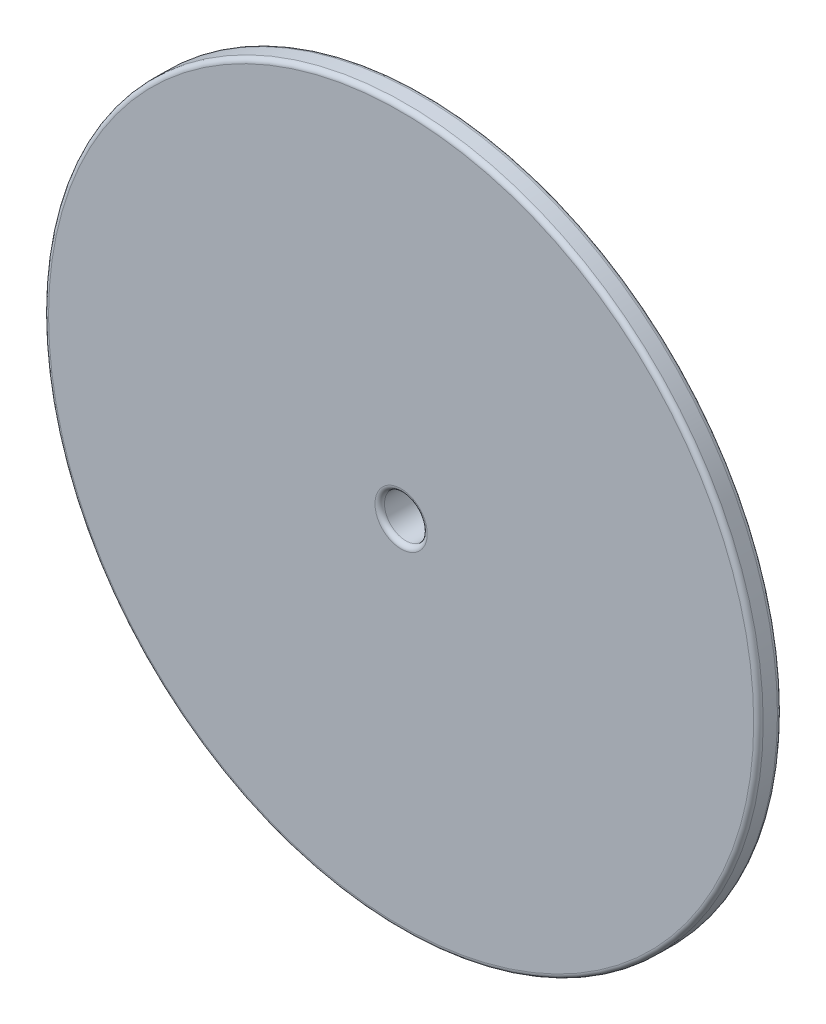
ISO-10303-21;
HEADER;
FILE_DESCRIPTION(('STEP AP214'),'2;1');
FILE_NAME('part.step','',(''),(''),'','','');
FILE_SCHEMA(('AUTOMOTIVE_DESIGN { 1 0 10303 214 1 1 1 1 }'));
ENDSEC;
DATA;
#1=APPLICATION_CONTEXT('core data for automotive mechanical design processes');
#2=APPLICATION_PROTOCOL_DEFINITION('international standard','automotive_design',2000,#1);
#3=PRODUCT_CONTEXT('',#1,'mechanical');
#4=PRODUCT('Part','Part','',(#3));
#5=PRODUCT_RELATED_PRODUCT_CATEGORY('part','',(#4));
#6=PRODUCT_DEFINITION_FORMATION('','',#4);
#7=PRODUCT_DEFINITION_CONTEXT('part definition',#1,'design');
#8=PRODUCT_DEFINITION('design','',#6,#7);
#9=PRODUCT_DEFINITION_SHAPE('','',#8);
#10=(LENGTH_UNIT() NAMED_UNIT(*) SI_UNIT(.MILLI.,.METRE.));
#11=(NAMED_UNIT(*) PLANE_ANGLE_UNIT() SI_UNIT($,.RADIAN.));
#12=(NAMED_UNIT(*) SI_UNIT($,.STERADIAN.) SOLID_ANGLE_UNIT());
#13=UNCERTAINTY_MEASURE_WITH_UNIT(LENGTH_MEASURE(1.E-05),#10,'distance_accuracy_value','');
#14=(GEOMETRIC_REPRESENTATION_CONTEXT(3) GLOBAL_UNCERTAINTY_ASSIGNED_CONTEXT((#13)) GLOBAL_UNIT_ASSIGNED_CONTEXT((#10,
#11,#12)) REPRESENTATION_CONTEXT('',''));
#15=CARTESIAN_POINT('',(0.,0.,0.));
#16=DIRECTION('',(0.,0.,1.));
#17=DIRECTION('',(1.,0.,0.));
#18=AXIS2_PLACEMENT_3D('',#15,#16,#17);
#19=CARTESIAN_POINT('',(10.2183194740514,38.6144386589878,58.6236604732304));
#20=DIRECTION('',(0.,0.,-1.));
#21=DIRECTION('',(-1.,0.,0.));
#22=AXIS2_PLACEMENT_3D('',#19,#20,#21);
#23=CYLINDRICAL_SURFACE('',#22,2.25);
#24=CARTESIAN_POINT('',(10.2183194740514,38.6144386589878,62.8236604732304));
#25=DIRECTION('',(0.,0.,-1.));
#26=DIRECTION('',(-1.,0.,0.));
#27=AXIS2_PLACEMENT_3D('',#24,#25,#26);
#28=CIRCLE('',#27,2.25);
#29=CARTESIAN_POINT('',(7.96831947405136,38.6144386589878,62.8236604732304));
#30=VERTEX_POINT('',#29);
#31=EDGE_CURVE('E10',#30,#30,#28,.T.);
#32=ORIENTED_EDGE('',*,*,#31,.T.);
#33=EDGE_LOOP('',(#32));
#34=FACE_BOUND('',#33,.T.);
#35=CARTESIAN_POINT('',(10.2183194740514,38.6144386589878,66.1236604732304));
#36=DIRECTION('',(0.,0.,1.));
#37=DIRECTION('',(1.,0.,0.));
#38=AXIS2_PLACEMENT_3D('',#35,#36,#37);
#39=CIRCLE('',#38,2.25);
#40=CARTESIAN_POINT('',(12.4683194740514,38.6144386589878,66.1236604732304));
#41=VERTEX_POINT('',#40);
#42=EDGE_CURVE('E58',#41,#41,#39,.T.);
#43=ORIENTED_EDGE('',*,*,#42,.T.);
#44=EDGE_LOOP('',(#43));
#45=FACE_BOUND('',#44,.T.);
#46=ADVANCED_FACE('F35',(#34,#45),#23,.F.);
#47=CARTESIAN_POINT('',(10.2183194740514,38.6144386589878,66.6236604732304));
#48=DIRECTION('',(0.,0.,1.));
#49=DIRECTION('',(1.,0.,0.));
#50=AXIS2_PLACEMENT_3D('',#47,#48,#49);
#51=PLANE('',#50);
#52=CARTESIAN_POINT('',(10.2183194740514,38.6144386589878,66.6236604732304));
#53=DIRECTION('',(0.,0.,1.));
#54=DIRECTION('',(1.,0.,0.));
#55=AXIS2_PLACEMENT_3D('',#52,#53,#54);
#56=CIRCLE('',#55,37.0979819134858);
#57=CARTESIAN_POINT('',(47.3163013875371,38.6144386589878,66.6236604732304));
#58=VERTEX_POINT('',#57);
#59=EDGE_CURVE('E61',#58,#58,#56,.T.);
#60=ORIENTED_EDGE('',*,*,#59,.T.);
#61=EDGE_LOOP('',(#60));
#62=FACE_BOUND('',#61,.T.);
#63=CARTESIAN_POINT('',(10.2183194740514,38.6144386589878,66.6236604732304));
#64=DIRECTION('',(0.,0.,1.));
#65=DIRECTION('',(1.,0.,0.));
#66=AXIS2_PLACEMENT_3D('',#63,#64,#65);
#67=CIRCLE('',#66,2.75);
#68=CARTESIAN_POINT('',(12.9683194740514,38.6144386589878,66.6236604732304));
#69=VERTEX_POINT('',#68);
#70=EDGE_CURVE('E64',#69,#69,#67,.F.);
#71=ORIENTED_EDGE('',*,*,#70,.T.);
#72=EDGE_LOOP('',(#71));
#73=FACE_BOUND('',#72,.T.);
#74=ADVANCED_FACE('F98',(#62,#73),#51,.T.);
#75=CARTESIAN_POINT('',(10.2183194740514,38.6144386589878,66.6236604732304));
#76=DIRECTION('',(0.,0.,-1.));
#77=DIRECTION('',(-1.,0.,0.));
#78=AXIS2_PLACEMENT_3D('',#75,#76,#77);
#79=CYLINDRICAL_SURFACE('',#78,37.5979819134858);
#80=CARTESIAN_POINT('',(10.2183194740514,38.6144386589878,64.6236604732304));
#81=DIRECTION('',(0.,0.,1.));
#82=DIRECTION('',(1.,0.,0.));
#83=AXIS2_PLACEMENT_3D('',#80,#81,#82);
#84=CIRCLE('',#83,37.5979819134858);
#85=CARTESIAN_POINT('',(47.8163013875371,38.6144386589878,64.6236604732304));
#86=VERTEX_POINT('',#85);
#87=EDGE_CURVE('E67',#86,#86,#84,.T.);
#88=ORIENTED_EDGE('',*,*,#87,.T.);
#89=EDGE_LOOP('',(#88));
#90=FACE_BOUND('',#89,.T.);
#91=CARTESIAN_POINT('',(10.2183194740514,38.6144386589878,66.1236604732304));
#92=DIRECTION('',(0.,0.,1.));
#93=DIRECTION('',(1.,0.,0.));
#94=AXIS2_PLACEMENT_3D('',#91,#92,#93);
#95=CIRCLE('',#94,37.5979819134858);
#96=CARTESIAN_POINT('',(47.8163013875371,38.6144386589878,66.1236604732304));
#97=VERTEX_POINT('',#96);
#98=EDGE_CURVE('E70',#97,#97,#95,.F.);
#99=ORIENTED_EDGE('',*,*,#98,.T.);
#100=EDGE_LOOP('',(#99));
#101=FACE_BOUND('',#100,.T.);
#102=ADVANCED_FACE('F92',(#90,#101),#79,.T.);
#103=CARTESIAN_POINT('',(10.2183194740514,38.6144386589878,64.1236604732304));
#104=DIRECTION('',(0.,0.,1.));
#105=DIRECTION('',(1.,0.,0.));
#106=AXIS2_PLACEMENT_3D('',#103,#104,#105);
#107=PLANE('',#106);
#108=CARTESIAN_POINT('',(10.2183194740514,38.6144386589878,64.1236604732304));
#109=DIRECTION('',(0.,0.,1.));
#110=DIRECTION('',(1.,0.,0.));
#111=AXIS2_PLACEMENT_3D('',#108,#109,#110);
#112=CIRCLE('',#111,17.5);
#113=CARTESIAN_POINT('',(27.7183194740514,38.6144386589878,64.1236604732304));
#114=VERTEX_POINT('',#113);
#115=EDGE_CURVE('E55',#114,#114,#112,.F.);
#116=ORIENTED_EDGE('',*,*,#115,.F.);
#117=EDGE_LOOP('',(#116));
#118=FACE_BOUND('',#117,.T.);
#119=CARTESIAN_POINT('',(10.2183194740514,38.6144386589878,64.1236604732304));
#120=DIRECTION('',(0.,0.,1.));
#121=DIRECTION('',(1.,0.,0.));
#122=AXIS2_PLACEMENT_3D('',#119,#120,#121);
#123=CIRCLE('',#122,37.0979819134858);
#124=CARTESIAN_POINT('',(47.3163013875371,38.6144386589878,64.1236604732304));
#125=VERTEX_POINT('',#124);
#126=EDGE_CURVE('E73',#125,#125,#123,.F.);
#127=ORIENTED_EDGE('',*,*,#126,.T.);
#128=EDGE_LOOP('',(#127));
#129=FACE_BOUND('',#128,.T.);
#130=ADVANCED_FACE('F77',(#118,#129),#107,.F.);
#131=CARTESIAN_POINT('',(10.2183194740514,38.6144386589878,64.6236604732304));
#132=DIRECTION('',(0.,0.,1.));
#133=DIRECTION('',(1.,0.,0.));
#134=AXIS2_PLACEMENT_3D('',#131,#132,#133);
#135=TOROIDAL_SURFACE('',#134,37.0979819134858,0.5);
#136=ORIENTED_EDGE('',*,*,#87,.F.);
#137=EDGE_LOOP('',(#136));
#138=FACE_BOUND('',#137,.T.);
#139=ORIENTED_EDGE('',*,*,#126,.F.);
#140=EDGE_LOOP('',(#139));
#141=FACE_BOUND('',#140,.T.);
#142=ADVANCED_FACE('F79',(#138,#141),#135,.T.);
#143=CARTESIAN_POINT('',(10.2183194740514,38.6144386589878,66.1236604732304));
#144=DIRECTION('',(0.,0.,1.));
#145=DIRECTION('',(1.,0.,0.));
#146=AXIS2_PLACEMENT_3D('',#143,#144,#145);
#147=TOROIDAL_SURFACE('',#146,37.0979819134858,0.5);
#148=ORIENTED_EDGE('',*,*,#98,.F.);
#149=EDGE_LOOP('',(#148));
#150=FACE_BOUND('',#149,.T.);
#151=ORIENTED_EDGE('',*,*,#59,.F.);
#152=EDGE_LOOP('',(#151));
#153=FACE_BOUND('',#152,.T.);
#154=ADVANCED_FACE('F81',(#150,#153),#147,.T.);
#155=CARTESIAN_POINT('',(10.2183194740514,38.6144386589878,66.1236604732304));
#156=DIRECTION('',(0.,0.,1.));
#157=DIRECTION('',(1.,0.,0.));
#158=AXIS2_PLACEMENT_3D('',#155,#156,#157);
#159=TOROIDAL_SURFACE('',#158,2.75,0.5);
#160=ORIENTED_EDGE('',*,*,#70,.F.);
#161=EDGE_LOOP('',(#160));
#162=FACE_BOUND('',#161,.T.);
#163=ORIENTED_EDGE('',*,*,#42,.F.);
#164=EDGE_LOOP('',(#163));
#165=FACE_BOUND('',#164,.T.);
#166=ADVANCED_FACE('F88',(#162,#165),#159,.T.);
#167=CARTESIAN_POINT('',(10.2183194740514,38.6144386589878,62.3236604732304));
#168=DIRECTION('',(0.,0.,1.));
#169=DIRECTION('',(1.,0.,0.));
#170=AXIS2_PLACEMENT_3D('',#167,#168,#169);
#171=CYLINDRICAL_SURFACE('',#170,17.5);
#172=CARTESIAN_POINT('',(10.2183194740514,38.6144386589878,62.8236604732304));
#173=DIRECTION('',(0.,0.,-1.));
#174=DIRECTION('',(-1.,0.,0.));
#175=AXIS2_PLACEMENT_3D('',#172,#173,#174);
#176=CIRCLE('',#175,17.5);
#177=CARTESIAN_POINT('',(-7.28168052594864,38.6144386589878,62.8236604732304));
#178=VERTEX_POINT('',#177);
#179=EDGE_CURVE('E42',#178,#178,#176,.F.);
#180=ORIENTED_EDGE('',*,*,#179,.T.);
#181=EDGE_LOOP('',(#180));
#182=FACE_BOUND('',#181,.T.);
#183=ORIENTED_EDGE('',*,*,#115,.T.);
#184=EDGE_LOOP('',(#183));
#185=FACE_BOUND('',#184,.T.);
#186=ADVANCED_FACE('F109',(#182,#185),#171,.T.);
#187=CARTESIAN_POINT('',(0.,0.,62.3236604732304));
#188=DIRECTION('',(0.,0.,-1.));
#189=DIRECTION('',(-1.,0.,0.));
#190=AXIS2_PLACEMENT_3D('',#187,#188,#189);
#191=PLANE('',#190);
#192=CARTESIAN_POINT('',(10.2183194740514,38.6144386589878,62.3236604732304));
#193=DIRECTION('',(0.,0.,-1.));
#194=DIRECTION('',(-1.,0.,0.));
#195=AXIS2_PLACEMENT_3D('',#192,#193,#194);
#196=CIRCLE('',#195,17.);
#197=CARTESIAN_POINT('',(-6.78168052594864,38.6144386589878,62.3236604732304));
#198=VERTEX_POINT('',#197);
#199=EDGE_CURVE('E46',#198,#198,#196,.T.);
#200=ORIENTED_EDGE('',*,*,#199,.T.);
#201=EDGE_LOOP('',(#200));
#202=FACE_BOUND('',#201,.T.);
#203=CARTESIAN_POINT('',(10.2183194740514,38.6144386589878,62.3236604732304));
#204=DIRECTION('',(0.,0.,-1.));
#205=DIRECTION('',(-1.,0.,0.));
#206=AXIS2_PLACEMENT_3D('',#203,#204,#205);
#207=CIRCLE('',#206,2.75);
#208=CARTESIAN_POINT('',(7.46831947405136,38.6144386589878,62.3236604732304));
#209=VERTEX_POINT('',#208);
#210=EDGE_CURVE('E50',#209,#209,#207,.F.);
#211=ORIENTED_EDGE('',*,*,#210,.T.);
#212=EDGE_LOOP('',(#211));
#213=FACE_BOUND('',#212,.T.);
#214=ADVANCED_FACE('F112',(#202,#213),#191,.T.);
#215=CARTESIAN_POINT('',(10.2183194740514,38.6144386589878,62.8236604732304));
#216=DIRECTION('',(0.,0.,-1.));
#217=DIRECTION('',(-1.,0.,0.));
#218=AXIS2_PLACEMENT_3D('',#215,#216,#217);
#219=TOROIDAL_SURFACE('',#218,17.,0.5);
#220=ORIENTED_EDGE('',*,*,#179,.F.);
#221=EDGE_LOOP('',(#220));
#222=FACE_BOUND('',#221,.T.);
#223=ORIENTED_EDGE('',*,*,#199,.F.);
#224=EDGE_LOOP('',(#223));
#225=FACE_BOUND('',#224,.T.);
#226=ADVANCED_FACE('F114',(#222,#225),#219,.T.);
#227=CARTESIAN_POINT('',(10.2183194740514,38.6144386589878,62.8236604732304));
#228=DIRECTION('',(0.,0.,-1.));
#229=DIRECTION('',(-1.,0.,0.));
#230=AXIS2_PLACEMENT_3D('',#227,#228,#229);
#231=TOROIDAL_SURFACE('',#230,2.75,0.5);
#232=ORIENTED_EDGE('',*,*,#210,.F.);
#233=EDGE_LOOP('',(#232));
#234=FACE_BOUND('',#233,.T.);
#235=ORIENTED_EDGE('',*,*,#31,.F.);
#236=EDGE_LOOP('',(#235));
#237=FACE_BOUND('',#236,.T.);
#238=ADVANCED_FACE('F37',(#234,#237),#231,.T.);
#239=CLOSED_SHELL('',(#46,#74,#102,#130,#142,#154,#166,#186,#214,#226,#238));
#240=MANIFOLD_SOLID_BREP('B2',#239);
#241=ADVANCED_BREP_SHAPE_REPRESENTATION('',(#18,#240),#14);
#242=SHAPE_DEFINITION_REPRESENTATION(#9,#241);
ENDSEC;
END-ISO-10303-21;
